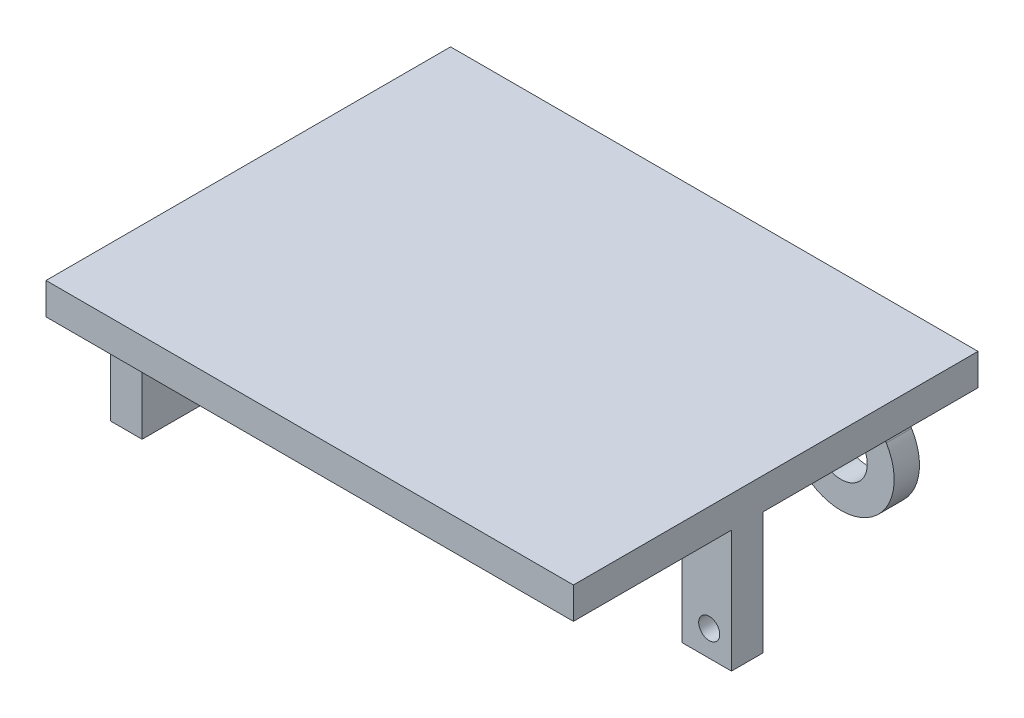
ISO-10303-21;
HEADER;
FILE_DESCRIPTION(('STEP AP214'),'2;1');
FILE_NAME('part.step','',(''),(''),'','','');
FILE_SCHEMA(('AUTOMOTIVE_DESIGN { 1 0 10303 214 1 1 1 1 }'));
ENDSEC;
DATA;
#1=APPLICATION_CONTEXT('core data for automotive mechanical design processes');
#2=APPLICATION_PROTOCOL_DEFINITION('international standard','automotive_design',2000,#1);
#3=PRODUCT_CONTEXT('',#1,'mechanical');
#4=PRODUCT('Part','Part','',(#3));
#5=PRODUCT_RELATED_PRODUCT_CATEGORY('part','',(#4));
#6=PRODUCT_DEFINITION_FORMATION('','',#4);
#7=PRODUCT_DEFINITION_CONTEXT('part definition',#1,'design');
#8=PRODUCT_DEFINITION('design','',#6,#7);
#9=PRODUCT_DEFINITION_SHAPE('','',#8);
#10=(LENGTH_UNIT() NAMED_UNIT(*) SI_UNIT(.MILLI.,.METRE.));
#11=(NAMED_UNIT(*) PLANE_ANGLE_UNIT() SI_UNIT($,.RADIAN.));
#12=(NAMED_UNIT(*) SI_UNIT($,.STERADIAN.) SOLID_ANGLE_UNIT());
#13=UNCERTAINTY_MEASURE_WITH_UNIT(LENGTH_MEASURE(1.E-05),#10,'distance_accuracy_value','');
#14=(GEOMETRIC_REPRESENTATION_CONTEXT(3) GLOBAL_UNCERTAINTY_ASSIGNED_CONTEXT((#13)) GLOBAL_UNIT_ASSIGNED_CONTEXT((#10,
#11,#12)) REPRESENTATION_CONTEXT('',''));
#15=CARTESIAN_POINT('',(0.,0.,0.));
#16=DIRECTION('',(0.,0.,1.));
#17=DIRECTION('',(1.,0.,0.));
#18=AXIS2_PLACEMENT_3D('',#15,#16,#17);
#19=CARTESIAN_POINT('',(0.375600944053645,9.13290377750628,2.4));
#20=DIRECTION('',(0.,1.,0.));
#21=DIRECTION('',(0.,0.,1.));
#22=AXIS2_PLACEMENT_3D('',#19,#20,#21);
#23=PLANE('',#22);
#24=DIRECTION('',(-1.,0.,0.));
#25=VECTOR('',#24,1.);
#26=CARTESIAN_POINT('',(-24.690248118354,9.13290377750628,20.4));
#27=LINE('',#26,#25);
#28=CARTESIAN_POINT('',(-17.6902481183561,9.13290377750628,20.4));
#29=VERTEX_POINT('',#28);
#30=CARTESIAN_POINT('',(-24.690248118354,9.13290377750628,20.4));
#31=VERTEX_POINT('',#30);
#32=EDGE_CURVE('E276',#29,#31,#27,.T.);
#33=ORIENTED_EDGE('',*,*,#32,.T.);
#34=DIRECTION('',(0.,0.,1.));
#35=VECTOR('',#34,1.);
#36=CARTESIAN_POINT('',(-24.690248118354,9.13290377750628,20.4));
#37=LINE('',#36,#35);
#38=CARTESIAN_POINT('',(-24.690248118354,9.13290377750628,23.4));
#39=VERTEX_POINT('',#38);
#40=EDGE_CURVE('E289',#31,#39,#37,.T.);
#41=ORIENTED_EDGE('',*,*,#40,.T.);
#42=DIRECTION('',(-1.,0.,0.));
#43=VECTOR('',#42,1.);
#44=CARTESIAN_POINT('',(-24.690248118354,9.13290377750628,23.4));
#45=LINE('',#44,#43);
#46=CARTESIAN_POINT('',(-17.6902481183561,9.13290377750628,23.4));
#47=VERTEX_POINT('',#46);
#48=EDGE_CURVE('E271',#47,#39,#45,.T.);
#49=ORIENTED_EDGE('',*,*,#48,.F.);
#50=DIRECTION('',(0.,0.,1.));
#51=VECTOR('',#50,1.);
#52=CARTESIAN_POINT('',(-17.6902481183561,9.13290377750628,20.4));
#53=LINE('',#52,#51);
#54=EDGE_CURVE('E293',#29,#47,#53,.T.);
#55=ORIENTED_EDGE('',*,*,#54,.F.);
#56=EDGE_LOOP('',(#33,#41,#49,#55));
#57=FACE_BOUND('',#56,.T.);
#58=DIRECTION('',(-1.,0.,0.));
#59=VECTOR('',#58,1.);
#60=CARTESIAN_POINT('',(-36.4472483248975,9.13290377750629,13.075983));
#61=LINE('',#60,#59);
#62=CARTESIAN_POINT('',(-36.4472483248975,9.13290377750628,13.075983));
#63=VERTEX_POINT('',#62);
#64=CARTESIAN_POINT('',(-39.4472483248975,9.13290377750628,13.075983));
#65=VERTEX_POINT('',#64);
#66=EDGE_CURVE('E50',#63,#65,#61,.T.);
#67=ORIENTED_EDGE('',*,*,#66,.F.);
#68=DIRECTION('',(0.,0.,1.));
#69=VECTOR('',#68,1.);
#70=CARTESIAN_POINT('',(-36.4472483248975,9.13290377750629,6.124016));
#71=LINE('',#70,#69);
#72=CARTESIAN_POINT('',(-36.4472483248975,9.13290377750628,6.12401599999998));
#73=VERTEX_POINT('',#72);
#74=EDGE_CURVE('E55',#73,#63,#71,.T.);
#75=ORIENTED_EDGE('',*,*,#74,.F.);
#76=DIRECTION('',(-1.,0.,0.));
#77=VECTOR('',#76,1.);
#78=CARTESIAN_POINT('',(-36.4472483248975,9.13290377750629,6.124016));
#79=LINE('',#78,#77);
#80=CARTESIAN_POINT('',(-39.4472483248975,9.13290377750629,6.124016));
#81=VERTEX_POINT('',#80);
#82=EDGE_CURVE('E216',#73,#81,#79,.T.);
#83=ORIENTED_EDGE('',*,*,#82,.T.);
#84=DIRECTION('',(0.,0.,-1.));
#85=VECTOR('',#84,1.);
#86=CARTESIAN_POINT('',(-39.4472483248975,9.13290377750628,2.4));
#87=LINE('',#86,#85);
#88=CARTESIAN_POINT('',(-39.4472483248975,9.13290377750628,0.));
#89=VERTEX_POINT('',#88);
#90=EDGE_CURVE('E392',#81,#89,#87,.T.);
#91=ORIENTED_EDGE('',*,*,#90,.T.);
#92=DIRECTION('',(1.,0.,0.));
#93=VECTOR('',#92,1.);
#94=CARTESIAN_POINT('',(-39.4472483248975,9.13290377750628,0.));
#95=LINE('',#94,#93);
#96=CARTESIAN_POINT('',(-13.4706940053491,9.13290377750628,0.));
#97=VERTEX_POINT('',#96);
#98=EDGE_CURVE('E367',#89,#97,#95,.T.);
#99=ORIENTED_EDGE('',*,*,#98,.T.);
#100=DIRECTION('',(0.,0.,-1.));
#101=VECTOR('',#100,1.);
#102=CARTESIAN_POINT('',(-13.4706940053491,9.13290377750628,2.4));
#103=LINE('',#102,#101);
#104=CARTESIAN_POINT('',(-13.4706940053491,9.13290377750628,2.4));
#105=VERTEX_POINT('',#104);
#106=EDGE_CURVE('E389',#105,#97,#103,.T.);
#107=ORIENTED_EDGE('',*,*,#106,.F.);
#108=DIRECTION('',(1.,0.,0.));
#109=VECTOR('',#108,1.);
#110=CARTESIAN_POINT('',(-39.4472483248975,9.13290377750628,2.4));
#111=LINE('',#110,#109);
#112=CARTESIAN_POINT('',(0.375600944053645,9.13290377750628,2.4));
#113=VERTEX_POINT('',#112);
#114=EDGE_CURVE('E11',#105,#113,#111,.T.);
#115=ORIENTED_EDGE('',*,*,#114,.T.);
#116=DIRECTION('',(0.,0.,-1.));
#117=VECTOR('',#116,1.);
#118=CARTESIAN_POINT('',(0.375600944053645,9.13290377750628,2.4));
#119=LINE('',#118,#117);
#120=CARTESIAN_POINT('',(0.375600944053645,9.13290377750628,0.));
#121=VERTEX_POINT('',#120);
#122=EDGE_CURVE('E380',#113,#121,#119,.T.);
#123=ORIENTED_EDGE('',*,*,#122,.T.);
#124=DIRECTION('',(1.,0.,0.));
#125=VECTOR('',#124,1.);
#126=CARTESIAN_POINT('',(0.375600944053645,9.13290377750628,0.));
#127=LINE('',#126,#125);
#128=CARTESIAN_POINT('',(10.6097508816418,9.13290377750628,0.));
#129=VERTEX_POINT('',#128);
#130=EDGE_CURVE('E355',#121,#129,#127,.T.);
#131=ORIENTED_EDGE('',*,*,#130,.T.);
#132=DIRECTION('',(0.,0.,-1.));
#133=VECTOR('',#132,1.);
#134=CARTESIAN_POINT('',(10.6097508816418,9.13290377750628,2.4));
#135=LINE('',#134,#133);
#136=CARTESIAN_POINT('',(10.6097508816418,9.13290377750628,20.4));
#137=VERTEX_POINT('',#136);
#138=EDGE_CURVE('E359',#137,#129,#135,.T.);
#139=ORIENTED_EDGE('',*,*,#138,.F.);
#140=DIRECTION('',(-1.,0.,0.));
#141=VECTOR('',#140,1.);
#142=CARTESIAN_POINT('',(5.90975088164212,9.13290377750628,20.4));
#143=LINE('',#142,#141);
#144=CARTESIAN_POINT('',(5.90975088164212,9.13290377750628,20.4));
#145=VERTEX_POINT('',#144);
#146=EDGE_CURVE('E314',#137,#145,#143,.T.);
#147=ORIENTED_EDGE('',*,*,#146,.T.);
#148=DIRECTION('',(0.,0.,1.));
#149=VECTOR('',#148,1.);
#150=CARTESIAN_POINT('',(5.90975088164212,9.13290377750628,20.4));
#151=LINE('',#150,#149);
#152=CARTESIAN_POINT('',(5.90975088164212,9.13290377750628,23.4));
#153=VERTEX_POINT('',#152);
#154=EDGE_CURVE('E327',#145,#153,#151,.T.);
#155=ORIENTED_EDGE('',*,*,#154,.T.);
#156=DIRECTION('',(-1.,0.,0.));
#157=VECTOR('',#156,1.);
#158=CARTESIAN_POINT('',(5.90975088164212,9.13290377750628,23.4));
#159=LINE('',#158,#157);
#160=CARTESIAN_POINT('',(10.6097508816418,9.13290377750628,23.4));
#161=VERTEX_POINT('',#160);
#162=EDGE_CURVE('E309',#161,#153,#159,.T.);
#163=ORIENTED_EDGE('',*,*,#162,.F.);
#164=CARTESIAN_POINT('',(10.6097508816418,9.13290377750628,38.4));
#165=VERTEX_POINT('',#164);
#166=EDGE_CURVE('E377',#165,#161,#135,.T.);
#167=ORIENTED_EDGE('',*,*,#166,.F.);
#168=DIRECTION('',(1.,0.,0.));
#169=VECTOR('',#168,1.);
#170=CARTESIAN_POINT('',(-39.4472483248975,9.13290377750628,38.4));
#171=LINE('',#170,#169);
#172=CARTESIAN_POINT('',(-39.4472483248975,9.13290377750628,38.4));
#173=VERTEX_POINT('',#172);
#174=EDGE_CURVE('E336',#173,#165,#171,.T.);
#175=ORIENTED_EDGE('',*,*,#174,.F.);
#176=CARTESIAN_POINT('',(-39.4472483248975,9.13290377750628,32.275984));
#177=VERTEX_POINT('',#176);
#178=EDGE_CURVE('E393',#173,#177,#87,.T.);
#179=ORIENTED_EDGE('',*,*,#178,.T.);
#180=DIRECTION('',(-1.,0.,0.));
#181=VECTOR('',#180,1.);
#182=CARTESIAN_POINT('',(-36.4472483248975,9.13290377750628,32.275984));
#183=LINE('',#182,#181);
#184=CARTESIAN_POINT('',(-36.4472483248975,9.13290377750628,32.275984));
#185=VERTEX_POINT('',#184);
#186=EDGE_CURVE('E251',#185,#177,#183,.T.);
#187=ORIENTED_EDGE('',*,*,#186,.F.);
#188=DIRECTION('',(0.,0.,1.));
#189=VECTOR('',#188,1.);
#190=CARTESIAN_POINT('',(-36.4472483248975,9.13290377750628,32.275984));
#191=LINE('',#190,#189);
#192=CARTESIAN_POINT('',(-36.4472483248975,9.13290377750628,25.324017));
#193=VERTEX_POINT('',#192);
#194=EDGE_CURVE('E237',#193,#185,#191,.T.);
#195=ORIENTED_EDGE('',*,*,#194,.F.);
#196=DIRECTION('',(-1.,0.,0.));
#197=VECTOR('',#196,1.);
#198=CARTESIAN_POINT('',(-36.4472483248975,9.13290377750628,25.324017));
#199=LINE('',#198,#197);
#200=CARTESIAN_POINT('',(-39.4472483248975,9.13290377750628,25.324017));
#201=VERTEX_POINT('',#200);
#202=EDGE_CURVE('E254',#193,#201,#199,.T.);
#203=ORIENTED_EDGE('',*,*,#202,.T.);
#204=EDGE_CURVE('E395',#201,#65,#87,.T.);
#205=ORIENTED_EDGE('',*,*,#204,.T.);
#206=EDGE_LOOP('',(#67,#75,#83,#91,#99,#107,#115,#123,#131,#139,#147,#155,#163,#167,#175,#179,
#187,#195,#203,#205));
#207=FACE_BOUND('',#206,.T.);
#208=ADVANCED_FACE('F34',(#57,#207),#23,.F.);
#209=CARTESIAN_POINT('',(-1.02695629777827E-12,-8.59013381260265E-13,2.4));
#210=DIRECTION('',(0.,0.,1.));
#211=DIRECTION('',(1.,0.,0.));
#212=AXIS2_PLACEMENT_3D('',#209,#210,#211);
#213=PLANE('',#212);
#214=ORIENTED_EDGE('',*,*,#114,.F.);
#215=DIRECTION('',(0.616631037907866,-0.787252286810694,0.));
#216=VECTOR('',#215,1.);
#217=CARTESIAN_POINT('',(-13.4706940053491,9.13290377750628,2.4));
#218=LINE('',#217,#216);
#219=CARTESIAN_POINT('',(-3.35801161441651,-3.77794865876277,2.4));
#220=VERTEX_POINT('',#219);
#221=EDGE_CURVE('E352',#105,#220,#218,.T.);
#222=ORIENTED_EDGE('',*,*,#221,.T.);
#223=CARTESIAN_POINT('',(-1.02695629777827E-12,-8.59013381260265E-13,2.4));
#224=DIRECTION('',(0.,0.,1.));
#225=DIRECTION('',(1.,0.,0.));
#226=AXIS2_PLACEMENT_3D('',#223,#224,#225);
#227=CIRCLE('',#226,5.0546155215595);
#228=CARTESIAN_POINT('',(4.30431290479305,2.64991103405545,2.4));
#229=VERTEX_POINT('',#228);
#230=EDGE_CURVE('E354',#220,#229,#227,.T.);
#231=ORIENTED_EDGE('',*,*,#230,.T.);
#232=DIRECTION('',(-0.518265579164981,0.855219731678816,0.));
#233=VECTOR('',#232,1.);
#234=CARTESIAN_POINT('',(4.30431290479305,2.64991103405545,2.4));
#235=LINE('',#234,#233);
#236=EDGE_CURVE('E357',#229,#113,#235,.T.);
#237=ORIENTED_EDGE('',*,*,#236,.T.);
#238=EDGE_LOOP('',(#214,#222,#231,#237));
#239=FACE_BOUND('',#238,.T.);
#240=CARTESIAN_POINT('',(-1.02695629777827E-12,-8.59013381260265E-13,2.4));
#241=DIRECTION('',(0.,0.,1.));
#242=DIRECTION('',(1.,0.,0.));
#243=AXIS2_PLACEMENT_3D('',#240,#241,#242);
#244=CIRCLE('',#243,2.49999999999947);
#245=CARTESIAN_POINT('',(2.49999999999844,-8.59013381260265E-13,2.4));
#246=VERTEX_POINT('',#245);
#247=EDGE_CURVE('E346',#246,#246,#244,.T.);
#248=ORIENTED_EDGE('',*,*,#247,.F.);
#249=EDGE_LOOP('',(#248));
#250=FACE_BOUND('',#249,.T.);
#251=ADVANCED_FACE('F429',(#239,#250),#213,.T.);
#252=CARTESIAN_POINT('',(-1.02695629777827E-12,-8.59013381260265E-13,0.));
#253=DIRECTION('',(0.,0.,1.));
#254=DIRECTION('',(1.,0.,0.));
#255=AXIS2_PLACEMENT_3D('',#252,#253,#254);
#256=PLANE('',#255);
#257=DIRECTION('',(0.,1.,0.));
#258=VECTOR('',#257,1.);
#259=CARTESIAN_POINT('',(10.6097508816418,9.13290377750628,0.));
#260=LINE('',#259,#258);
#261=CARTESIAN_POINT('',(10.6097508816418,12.1289037733501,0.));
#262=VERTEX_POINT('',#261);
#263=EDGE_CURVE('E349',#129,#262,#260,.T.);
#264=ORIENTED_EDGE('',*,*,#263,.F.);
#265=ORIENTED_EDGE('',*,*,#130,.F.);
#266=DIRECTION('',(-0.518265579164981,0.855219731678816,0.));
#267=VECTOR('',#266,1.);
#268=CARTESIAN_POINT('',(4.30431290479305,2.64991103405545,0.));
#269=LINE('',#268,#267);
#270=CARTESIAN_POINT('',(4.30431290479305,2.64991103405545,0.));
#271=VERTEX_POINT('',#270);
#272=EDGE_CURVE('E373',#271,#121,#269,.T.);
#273=ORIENTED_EDGE('',*,*,#272,.F.);
#274=CARTESIAN_POINT('',(-1.02695629777827E-12,-8.59013381260265E-13,0.));
#275=DIRECTION('',(0.,0.,1.));
#276=DIRECTION('',(1.,0.,0.));
#277=AXIS2_PLACEMENT_3D('',#274,#275,#276);
#278=CIRCLE('',#277,5.0546155215595);
#279=CARTESIAN_POINT('',(-3.35801161441651,-3.77794865876277,0.));
#280=VERTEX_POINT('',#279);
#281=EDGE_CURVE('E371',#280,#271,#278,.T.);
#282=ORIENTED_EDGE('',*,*,#281,.F.);
#283=DIRECTION('',(0.616631037907866,-0.787252286810694,0.));
#284=VECTOR('',#283,1.);
#285=CARTESIAN_POINT('',(-13.4706940053491,9.13290377750628,0.));
#286=LINE('',#285,#284);
#287=EDGE_CURVE('E369',#97,#280,#286,.T.);
#288=ORIENTED_EDGE('',*,*,#287,.F.);
#289=ORIENTED_EDGE('',*,*,#98,.F.);
#290=DIRECTION('',(0.,-1.,0.));
#291=VECTOR('',#290,1.);
#292=CARTESIAN_POINT('',(-39.4472483248975,12.1289037733501,0.));
#293=LINE('',#292,#291);
#294=CARTESIAN_POINT('',(-39.4472483248975,12.1289037733501,0.));
#295=VERTEX_POINT('',#294);
#296=EDGE_CURVE('E364',#295,#89,#293,.T.);
#297=ORIENTED_EDGE('',*,*,#296,.F.);
#298=DIRECTION('',(-1.,0.,0.));
#299=VECTOR('',#298,1.);
#300=CARTESIAN_POINT('',(-39.4472483248975,12.1289037733501,0.));
#301=LINE('',#300,#299);
#302=EDGE_CURVE('E362',#262,#295,#301,.T.);
#303=ORIENTED_EDGE('',*,*,#302,.F.);
#304=EDGE_LOOP('',(#264,#265,#273,#282,#288,#289,#297,#303));
#305=FACE_BOUND('',#304,.T.);
#306=CARTESIAN_POINT('',(-1.02695629777827E-12,-8.59013381260265E-13,0.));
#307=DIRECTION('',(0.,0.,1.));
#308=DIRECTION('',(1.,0.,0.));
#309=AXIS2_PLACEMENT_3D('',#306,#307,#308);
#310=CIRCLE('',#309,2.49999999999947);
#311=CARTESIAN_POINT('',(2.49999999999844,-8.59013381260265E-13,0.));
#312=VERTEX_POINT('',#311);
#313=EDGE_CURVE('E344',#312,#312,#310,.T.);
#314=ORIENTED_EDGE('',*,*,#313,.T.);
#315=EDGE_LOOP('',(#314));
#316=FACE_BOUND('',#315,.T.);
#317=ADVANCED_FACE('F410',(#305,#316),#256,.F.);
#318=CARTESIAN_POINT('',(10.6097508816418,9.13290377750628,2.4));
#319=DIRECTION('',(-1.,0.,0.));
#320=DIRECTION('',(0.,0.,1.));
#321=AXIS2_PLACEMENT_3D('',#318,#319,#320);
#322=PLANE('',#321);
#323=ORIENTED_EDGE('',*,*,#263,.T.);
#324=DIRECTION('',(0.,0.,-1.));
#325=VECTOR('',#324,1.);
#326=CARTESIAN_POINT('',(10.6097508816418,12.1289037733501,2.4));
#327=LINE('',#326,#325);
#328=CARTESIAN_POINT('',(10.6097508816418,12.1289037733501,38.4));
#329=VERTEX_POINT('',#328);
#330=EDGE_CURVE('E38',#329,#262,#327,.T.);
#331=ORIENTED_EDGE('',*,*,#330,.F.);
#332=DIRECTION('',(0.,1.,0.));
#333=VECTOR('',#332,1.);
#334=CARTESIAN_POINT('',(10.6097508816418,9.13290377750628,38.4));
#335=LINE('',#334,#333);
#336=EDGE_CURVE('E339',#165,#329,#335,.T.);
#337=ORIENTED_EDGE('',*,*,#336,.F.);
#338=ORIENTED_EDGE('',*,*,#166,.T.);
#339=DIRECTION('',(0.,1.,0.));
#340=VECTOR('',#339,1.);
#341=CARTESIAN_POINT('',(10.6097508816418,9.13290377750628,23.4));
#342=LINE('',#341,#340);
#343=CARTESIAN_POINT('',(10.6097508816418,-2.45709622249371,23.4));
#344=VERTEX_POINT('',#343);
#345=EDGE_CURVE('E323',#344,#161,#342,.T.);
#346=ORIENTED_EDGE('',*,*,#345,.F.);
#347=DIRECTION('',(0.,0.,1.));
#348=VECTOR('',#347,1.);
#349=CARTESIAN_POINT('',(10.6097508816418,-2.45709622249371,20.4));
#350=LINE('',#349,#348);
#351=CARTESIAN_POINT('',(10.6097508816418,-2.45709622249371,20.4));
#352=VERTEX_POINT('',#351);
#353=EDGE_CURVE('E331',#352,#344,#350,.T.);
#354=ORIENTED_EDGE('',*,*,#353,.F.);
#355=DIRECTION('',(0.,1.,0.));
#356=VECTOR('',#355,1.);
#357=CARTESIAN_POINT('',(10.6097508816418,9.13290377750628,20.4));
#358=LINE('',#357,#356);
#359=EDGE_CURVE('E312',#352,#137,#358,.T.);
#360=ORIENTED_EDGE('',*,*,#359,.T.);
#361=ORIENTED_EDGE('',*,*,#138,.T.);
#362=EDGE_LOOP('',(#323,#331,#337,#338,#346,#354,#360,#361));
#363=FACE_BOUND('',#362,.T.);
#364=ADVANCED_FACE('F36',(#363),#322,.F.);
#365=CARTESIAN_POINT('',(-39.4472483248975,12.1289037733501,2.4));
#366=DIRECTION('',(0.,-1.,0.));
#367=DIRECTION('',(0.,0.,-1.));
#368=AXIS2_PLACEMENT_3D('',#365,#366,#367);
#369=PLANE('',#368);
#370=ORIENTED_EDGE('',*,*,#302,.T.);
#371=DIRECTION('',(0.,0.,-1.));
#372=VECTOR('',#371,1.);
#373=CARTESIAN_POINT('',(-39.4472483248975,12.1289037733501,2.4));
#374=LINE('',#373,#372);
#375=CARTESIAN_POINT('',(-39.4472483248975,12.1289037733501,38.4));
#376=VERTEX_POINT('',#375);
#377=EDGE_CURVE('E394',#376,#295,#374,.T.);
#378=ORIENTED_EDGE('',*,*,#377,.F.);
#379=DIRECTION('',(-1.,0.,0.));
#380=VECTOR('',#379,1.);
#381=CARTESIAN_POINT('',(10.6097508816418,12.1289037733501,38.4));
#382=LINE('',#381,#380);
#383=EDGE_CURVE('E342',#329,#376,#382,.T.);
#384=ORIENTED_EDGE('',*,*,#383,.F.);
#385=ORIENTED_EDGE('',*,*,#330,.T.);
#386=EDGE_LOOP('',(#370,#378,#384,#385));
#387=FACE_BOUND('',#386,.T.);
#388=ADVANCED_FACE('F403',(#387),#369,.F.);
#389=CARTESIAN_POINT('',(-39.4472483248975,12.1289037733501,2.4));
#390=DIRECTION('',(1.,0.,0.));
#391=DIRECTION('',(0.,0.,-1.));
#392=AXIS2_PLACEMENT_3D('',#389,#390,#391);
#393=PLANE('',#392);
#394=ORIENTED_EDGE('',*,*,#296,.T.);
#395=ORIENTED_EDGE('',*,*,#90,.F.);
#396=DIRECTION('',(0.,1.,0.));
#397=VECTOR('',#396,1.);
#398=CARTESIAN_POINT('',(-39.4472483248975,-2.49109835249372,6.12401599999998));
#399=LINE('',#398,#397);
#400=CARTESIAN_POINT('',(-39.4472483248975,-2.49109835249372,6.12401599999998));
#401=VERTEX_POINT('',#400);
#402=EDGE_CURVE('E223',#401,#81,#399,.T.);
#403=ORIENTED_EDGE('',*,*,#402,.F.);
#404=DIRECTION('',(0.,0.,-1.));
#405=VECTOR('',#404,1.);
#406=CARTESIAN_POINT('',(-39.4472483248975,-2.49109835249372,13.075983));
#407=LINE('',#406,#405);
#408=CARTESIAN_POINT('',(-39.4472483248975,-2.49109835249372,13.075983));
#409=VERTEX_POINT('',#408);
#410=EDGE_CURVE('E221',#409,#401,#407,.T.);
#411=ORIENTED_EDGE('',*,*,#410,.F.);
#412=DIRECTION('',(0.,-1.,0.));
#413=VECTOR('',#412,1.);
#414=CARTESIAN_POINT('',(-39.4472483248975,-2.49109835249372,13.075983));
#415=LINE('',#414,#413);
#416=EDGE_CURVE('E206',#65,#409,#415,.T.);
#417=ORIENTED_EDGE('',*,*,#416,.F.);
#418=ORIENTED_EDGE('',*,*,#204,.F.);
#419=DIRECTION('',(0.,1.,0.));
#420=VECTOR('',#419,1.);
#421=CARTESIAN_POINT('',(-39.4472483248975,-2.49109835249372,25.324017));
#422=LINE('',#421,#420);
#423=CARTESIAN_POINT('',(-39.4472483248975,-2.49109835249372,25.324017));
#424=VERTEX_POINT('',#423);
#425=EDGE_CURVE('E245',#424,#201,#422,.T.);
#426=ORIENTED_EDGE('',*,*,#425,.F.);
#427=DIRECTION('',(0.,0.,-1.));
#428=VECTOR('',#427,1.);
#429=CARTESIAN_POINT('',(-39.4472483248975,-2.49109835249372,32.275984));
#430=LINE('',#429,#428);
#431=CARTESIAN_POINT('',(-39.4472483248975,-2.49109835249372,32.275984));
#432=VERTEX_POINT('',#431);
#433=EDGE_CURVE('E229',#432,#424,#430,.T.);
#434=ORIENTED_EDGE('',*,*,#433,.F.);
#435=DIRECTION('',(0.,-1.,0.));
#436=VECTOR('',#435,1.);
#437=CARTESIAN_POINT('',(-39.4472483248975,-2.49109835249372,32.275984));
#438=LINE('',#437,#436);
#439=EDGE_CURVE('E234',#177,#432,#438,.T.);
#440=ORIENTED_EDGE('',*,*,#439,.F.);
#441=ORIENTED_EDGE('',*,*,#178,.F.);
#442=DIRECTION('',(0.,-1.,0.));
#443=VECTOR('',#442,1.);
#444=CARTESIAN_POINT('',(-39.4472483248975,12.1289037733501,38.4));
#445=LINE('',#444,#443);
#446=EDGE_CURVE('E330',#376,#173,#445,.T.);
#447=ORIENTED_EDGE('',*,*,#446,.F.);
#448=ORIENTED_EDGE('',*,*,#377,.T.);
#449=EDGE_LOOP('',(#394,#395,#403,#411,#417,#418,#426,#434,#440,#441,#447,#448));
#450=FACE_BOUND('',#449,.T.);
#451=ADVANCED_FACE('F415',(#450),#393,.F.);
#452=CARTESIAN_POINT('',(-13.4706940053491,9.13290377750628,2.4));
#453=DIRECTION('',(0.787252286810694,0.616631037907866,0.));
#454=DIRECTION('',(-0.616631037907866,0.787252286810694,0.));
#455=AXIS2_PLACEMENT_3D('',#452,#453,#454);
#456=PLANE('',#455);
#457=ORIENTED_EDGE('',*,*,#287,.T.);
#458=DIRECTION('',(0.,0.,-1.));
#459=VECTOR('',#458,1.);
#460=CARTESIAN_POINT('',(-3.35801161441651,-3.77794865876277,2.4));
#461=LINE('',#460,#459);
#462=EDGE_CURVE('E386',#220,#280,#461,.T.);
#463=ORIENTED_EDGE('',*,*,#462,.F.);
#464=ORIENTED_EDGE('',*,*,#221,.F.);
#465=ORIENTED_EDGE('',*,*,#106,.T.);
#466=EDGE_LOOP('',(#457,#463,#464,#465));
#467=FACE_BOUND('',#466,.T.);
#468=ADVANCED_FACE('F447',(#467),#456,.F.);
#469=CARTESIAN_POINT('',(-1.02695629777827E-12,-8.59013381260265E-13,2.4));
#470=DIRECTION('',(0.,0.,-1.));
#471=DIRECTION('',(-1.,0.,0.));
#472=AXIS2_PLACEMENT_3D('',#469,#470,#471);
#473=CYLINDRICAL_SURFACE('',#472,5.0546155215595);
#474=ORIENTED_EDGE('',*,*,#281,.T.);
#475=DIRECTION('',(0.,0.,-1.));
#476=VECTOR('',#475,1.);
#477=CARTESIAN_POINT('',(4.30431290479305,2.64991103405545,2.4));
#478=LINE('',#477,#476);
#479=EDGE_CURVE('E383',#229,#271,#478,.T.);
#480=ORIENTED_EDGE('',*,*,#479,.F.);
#481=ORIENTED_EDGE('',*,*,#230,.F.);
#482=ORIENTED_EDGE('',*,*,#462,.T.);
#483=EDGE_LOOP('',(#474,#480,#481,#482));
#484=FACE_BOUND('',#483,.T.);
#485=ADVANCED_FACE('F443',(#484),#473,.T.);
#486=CARTESIAN_POINT('',(4.30431290479305,2.64991103405545,2.4));
#487=DIRECTION('',(-0.855219731678816,-0.518265579164981,0.));
#488=DIRECTION('',(0.518265579164981,-0.855219731678817,0.));
#489=AXIS2_PLACEMENT_3D('',#486,#487,#488);
#490=PLANE('',#489);
#491=ORIENTED_EDGE('',*,*,#272,.T.);
#492=ORIENTED_EDGE('',*,*,#122,.F.);
#493=ORIENTED_EDGE('',*,*,#236,.F.);
#494=ORIENTED_EDGE('',*,*,#479,.T.);
#495=EDGE_LOOP('',(#491,#492,#493,#494));
#496=FACE_BOUND('',#495,.T.);
#497=ADVANCED_FACE('F439',(#496),#490,.F.);
#498=CARTESIAN_POINT('',(-1.02695629777827E-12,-8.59013381260265E-13,2.4));
#499=DIRECTION('',(0.,0.,-1.));
#500=DIRECTION('',(-1.,0.,0.));
#501=AXIS2_PLACEMENT_3D('',#498,#499,#500);
#502=CYLINDRICAL_SURFACE('',#501,2.49999999999947);
#503=ORIENTED_EDGE('',*,*,#247,.T.);
#504=EDGE_LOOP('',(#503));
#505=FACE_BOUND('',#504,.T.);
#506=ORIENTED_EDGE('',*,*,#313,.F.);
#507=EDGE_LOOP('',(#506));
#508=FACE_BOUND('',#507,.T.);
#509=ADVANCED_FACE('F442',(#505,#508),#502,.F.);
#510=CARTESIAN_POINT('',(0.,0.,38.4));
#511=DIRECTION('',(0.,0.,1.));
#512=DIRECTION('',(1.,0.,0.));
#513=AXIS2_PLACEMENT_3D('',#510,#511,#512);
#514=PLANE('',#513);
#515=ORIENTED_EDGE('',*,*,#446,.T.);
#516=ORIENTED_EDGE('',*,*,#174,.T.);
#517=ORIENTED_EDGE('',*,*,#336,.T.);
#518=ORIENTED_EDGE('',*,*,#383,.T.);
#519=EDGE_LOOP('',(#515,#516,#517,#518));
#520=FACE_BOUND('',#519,.T.);
#521=ADVANCED_FACE('F497',(#520),#514,.T.);
#522=CARTESIAN_POINT('',(5.90975088164212,9.13290377750628,20.4));
#523=DIRECTION('',(-1.,0.,0.));
#524=DIRECTION('',(0.,-1.,0.));
#525=AXIS2_PLACEMENT_3D('',#522,#523,#524);
#526=PLANE('',#525);
#527=DIRECTION('',(0.,-1.,0.));
#528=VECTOR('',#527,1.);
#529=CARTESIAN_POINT('',(5.90975088164212,9.13290377750628,23.4));
#530=LINE('',#529,#528);
#531=CARTESIAN_POINT('',(5.90975088164213,-2.45709622249371,23.4));
#532=VERTEX_POINT('',#531);
#533=EDGE_CURVE('E302',#153,#532,#530,.T.);
#534=ORIENTED_EDGE('',*,*,#533,.F.);
#535=ORIENTED_EDGE('',*,*,#154,.F.);
#536=DIRECTION('',(0.,-1.,0.));
#537=VECTOR('',#536,1.);
#538=CARTESIAN_POINT('',(5.90975088164212,9.13290377750628,20.4));
#539=LINE('',#538,#537);
#540=CARTESIAN_POINT('',(5.90975088164213,-2.45709622249371,20.4));
#541=VERTEX_POINT('',#540);
#542=EDGE_CURVE('E305',#145,#541,#539,.T.);
#543=ORIENTED_EDGE('',*,*,#542,.T.);
#544=DIRECTION('',(0.,0.,1.));
#545=VECTOR('',#544,1.);
#546=CARTESIAN_POINT('',(5.90975088164213,-2.45709622249371,20.4));
#547=LINE('',#546,#545);
#548=EDGE_CURVE('E317',#541,#532,#547,.T.);
#549=ORIENTED_EDGE('',*,*,#548,.T.);
#550=EDGE_LOOP('',(#534,#535,#543,#549));
#551=FACE_BOUND('',#550,.T.);
#552=ADVANCED_FACE('F501',(#551),#526,.T.);
#553=CARTESIAN_POINT('',(5.90975088164213,-2.45709622249371,20.4));
#554=DIRECTION('',(0.,-1.,0.));
#555=DIRECTION('',(1.,0.,0.));
#556=AXIS2_PLACEMENT_3D('',#553,#554,#555);
#557=PLANE('',#556);
#558=DIRECTION('',(1.,0.,0.));
#559=VECTOR('',#558,1.);
#560=CARTESIAN_POINT('',(5.90975088164213,-2.45709622249371,23.4));
#561=LINE('',#560,#559);
#562=EDGE_CURVE('E320',#532,#344,#561,.T.);
#563=ORIENTED_EDGE('',*,*,#562,.F.);
#564=ORIENTED_EDGE('',*,*,#548,.F.);
#565=DIRECTION('',(1.,0.,0.));
#566=VECTOR('',#565,1.);
#567=CARTESIAN_POINT('',(5.90975088164213,-2.45709622249371,20.4));
#568=LINE('',#567,#566);
#569=EDGE_CURVE('E308',#541,#352,#568,.T.);
#570=ORIENTED_EDGE('',*,*,#569,.T.);
#571=ORIENTED_EDGE('',*,*,#353,.T.);
#572=EDGE_LOOP('',(#563,#564,#570,#571));
#573=FACE_BOUND('',#572,.T.);
#574=ADVANCED_FACE('F516',(#573),#557,.T.);
#575=CARTESIAN_POINT('',(0.,0.,20.4));
#576=DIRECTION('',(0.,0.,1.));
#577=DIRECTION('',(1.,0.,0.));
#578=AXIS2_PLACEMENT_3D('',#575,#576,#577);
#579=PLANE('',#578);
#580=CARTESIAN_POINT('',(8.49999999987004,-9.15933995315754E-13,20.4));
#581=DIRECTION('',(0.,0.,1.));
#582=DIRECTION('',(1.,0.,0.));
#583=AXIS2_PLACEMENT_3D('',#580,#581,#582);
#584=CIRCLE('',#583,1.00000000000377);
#585=CARTESIAN_POINT('',(9.49999999987382,-9.15933995315754E-13,20.4));
#586=VERTEX_POINT('',#585);
#587=EDGE_CURVE('E299',#586,#586,#584,.T.);
#588=ORIENTED_EDGE('',*,*,#587,.T.);
#589=EDGE_LOOP('',(#588));
#590=FACE_BOUND('',#589,.T.);
#591=ORIENTED_EDGE('',*,*,#542,.F.);
#592=ORIENTED_EDGE('',*,*,#146,.F.);
#593=ORIENTED_EDGE('',*,*,#359,.F.);
#594=ORIENTED_EDGE('',*,*,#569,.F.);
#595=EDGE_LOOP('',(#591,#592,#593,#594));
#596=FACE_BOUND('',#595,.T.);
#597=ADVANCED_FACE('F526',(#590,#596),#579,.F.);
#598=CARTESIAN_POINT('',(0.,0.,23.4));
#599=DIRECTION('',(0.,0.,1.));
#600=DIRECTION('',(1.,0.,0.));
#601=AXIS2_PLACEMENT_3D('',#598,#599,#600);
#602=PLANE('',#601);
#603=CARTESIAN_POINT('',(8.49999999987004,-9.15933995315754E-13,23.4));
#604=DIRECTION('',(0.,0.,1.));
#605=DIRECTION('',(1.,0.,0.));
#606=AXIS2_PLACEMENT_3D('',#603,#604,#605);
#607=CIRCLE('',#606,1.00000000000377);
#608=CARTESIAN_POINT('',(9.49999999987382,-9.15933995315754E-13,23.4));
#609=VERTEX_POINT('',#608);
#610=EDGE_CURVE('E292',#609,#609,#607,.T.);
#611=ORIENTED_EDGE('',*,*,#610,.F.);
#612=EDGE_LOOP('',(#611));
#613=FACE_BOUND('',#612,.T.);
#614=ORIENTED_EDGE('',*,*,#533,.T.);
#615=ORIENTED_EDGE('',*,*,#562,.T.);
#616=ORIENTED_EDGE('',*,*,#345,.T.);
#617=ORIENTED_EDGE('',*,*,#162,.T.);
#618=EDGE_LOOP('',(#614,#615,#616,#617));
#619=FACE_BOUND('',#618,.T.);
#620=ADVANCED_FACE('F536',(#613,#619),#602,.T.);
#621=CARTESIAN_POINT('',(8.49999999987004,-9.15933995315754E-13,20.4));
#622=DIRECTION('',(0.,0.,1.));
#623=DIRECTION('',(1.,0.,0.));
#624=AXIS2_PLACEMENT_3D('',#621,#622,#623);
#625=CYLINDRICAL_SURFACE('',#624,1.00000000000377);
#626=ORIENTED_EDGE('',*,*,#587,.F.);
#627=EDGE_LOOP('',(#626));
#628=FACE_BOUND('',#627,.T.);
#629=ORIENTED_EDGE('',*,*,#610,.T.);
#630=EDGE_LOOP('',(#629));
#631=FACE_BOUND('',#630,.T.);
#632=ADVANCED_FACE('F546',(#628,#631),#625,.F.);
#633=CARTESIAN_POINT('',(-24.690248118354,9.13290377750628,20.4));
#634=DIRECTION('',(-1.,0.,0.));
#635=DIRECTION('',(0.,0.,1.));
#636=AXIS2_PLACEMENT_3D('',#633,#634,#635);
#637=PLANE('',#636);
#638=DIRECTION('',(0.,-1.,0.));
#639=VECTOR('',#638,1.);
#640=CARTESIAN_POINT('',(-24.690248118354,9.13290377750628,23.4));
#641=LINE('',#640,#639);
#642=CARTESIAN_POINT('',(-24.690248118354,-2.4601006024936,23.4));
#643=VERTEX_POINT('',#642);
#644=EDGE_CURVE('E264',#39,#643,#641,.T.);
#645=ORIENTED_EDGE('',*,*,#644,.F.);
#646=ORIENTED_EDGE('',*,*,#40,.F.);
#647=DIRECTION('',(0.,-1.,0.));
#648=VECTOR('',#647,1.);
#649=CARTESIAN_POINT('',(-24.690248118354,9.13290377750628,20.4));
#650=LINE('',#649,#648);
#651=CARTESIAN_POINT('',(-24.690248118354,-2.4601006024936,20.4));
#652=VERTEX_POINT('',#651);
#653=EDGE_CURVE('E267',#31,#652,#650,.T.);
#654=ORIENTED_EDGE('',*,*,#653,.T.);
#655=DIRECTION('',(0.,0.,1.));
#656=VECTOR('',#655,1.);
#657=CARTESIAN_POINT('',(-24.690248118354,-2.4601006024936,20.4));
#658=LINE('',#657,#656);
#659=EDGE_CURVE('E279',#652,#643,#658,.T.);
#660=ORIENTED_EDGE('',*,*,#659,.T.);
#661=EDGE_LOOP('',(#645,#646,#654,#660));
#662=FACE_BOUND('',#661,.T.);
#663=ADVANCED_FACE('F556',(#662),#637,.T.);
#664=CARTESIAN_POINT('',(-17.6902481183561,9.13290377750628,20.4));
#665=DIRECTION('',(1.,0.,0.));
#666=DIRECTION('',(0.,0.,-1.));
#667=AXIS2_PLACEMENT_3D('',#664,#665,#666);
#668=PLANE('',#667);
#669=DIRECTION('',(0.,1.,0.));
#670=VECTOR('',#669,1.);
#671=CARTESIAN_POINT('',(-17.6902481183561,9.13290377750628,23.4));
#672=LINE('',#671,#670);
#673=CARTESIAN_POINT('',(-17.6902481183561,-2.4601006024936,23.4));
#674=VERTEX_POINT('',#673);
#675=EDGE_CURVE('E285',#674,#47,#672,.T.);
#676=ORIENTED_EDGE('',*,*,#675,.F.);
#677=DIRECTION('',(0.,0.,1.));
#678=VECTOR('',#677,1.);
#679=CARTESIAN_POINT('',(-17.6902481183561,-2.4601006024936,20.4));
#680=LINE('',#679,#678);
#681=CARTESIAN_POINT('',(-17.6902481183561,-2.4601006024936,20.4));
#682=VERTEX_POINT('',#681);
#683=EDGE_CURVE('E296',#682,#674,#680,.T.);
#684=ORIENTED_EDGE('',*,*,#683,.F.);
#685=DIRECTION('',(0.,1.,0.));
#686=VECTOR('',#685,1.);
#687=CARTESIAN_POINT('',(-17.6902481183561,9.13290377750628,20.4));
#688=LINE('',#687,#686);
#689=EDGE_CURVE('E274',#682,#29,#688,.T.);
#690=ORIENTED_EDGE('',*,*,#689,.T.);
#691=ORIENTED_EDGE('',*,*,#54,.T.);
#692=EDGE_LOOP('',(#676,#684,#690,#691));
#693=FACE_BOUND('',#692,.T.);
#694=ADVANCED_FACE('F566',(#693),#668,.T.);
#695=CARTESIAN_POINT('',(-24.690248118354,-2.4601006024936,20.4));
#696=DIRECTION('',(0.,-1.,0.));
#697=DIRECTION('',(0.,0.,-1.));
#698=AXIS2_PLACEMENT_3D('',#695,#696,#697);
#699=PLANE('',#698);
#700=DIRECTION('',(1.,0.,0.));
#701=VECTOR('',#700,1.);
#702=CARTESIAN_POINT('',(-24.690248118354,-2.4601006024936,23.4));
#703=LINE('',#702,#701);
#704=EDGE_CURVE('E282',#643,#674,#703,.T.);
#705=ORIENTED_EDGE('',*,*,#704,.F.);
#706=ORIENTED_EDGE('',*,*,#659,.F.);
#707=DIRECTION('',(1.,0.,0.));
#708=VECTOR('',#707,1.);
#709=CARTESIAN_POINT('',(-24.690248118354,-2.4601006024936,20.4));
#710=LINE('',#709,#708);
#711=EDGE_CURVE('E270',#652,#682,#710,.T.);
#712=ORIENTED_EDGE('',*,*,#711,.T.);
#713=ORIENTED_EDGE('',*,*,#683,.T.);
#714=EDGE_LOOP('',(#705,#706,#712,#713));
#715=FACE_BOUND('',#714,.T.);
#716=ADVANCED_FACE('F576',(#715),#699,.T.);
#717=CARTESIAN_POINT('',(0.,0.,20.4));
#718=DIRECTION('',(0.,0.,1.));
#719=DIRECTION('',(1.,0.,0.));
#720=AXIS2_PLACEMENT_3D('',#717,#718,#719);
#721=PLANE('',#720);
#722=CARTESIAN_POINT('',(-19.5000000001287,-9.15933995315754E-13,20.4));
#723=DIRECTION('',(0.,0.,1.));
#724=DIRECTION('',(1.,0.,0.));
#725=AXIS2_PLACEMENT_3D('',#722,#723,#724);
#726=CIRCLE('',#725,0.999999999996459);
#727=CARTESIAN_POINT('',(-18.5000000001322,-9.15933995315754E-13,20.4));
#728=VERTEX_POINT('',#727);
#729=EDGE_CURVE('E261',#728,#728,#726,.T.);
#730=ORIENTED_EDGE('',*,*,#729,.T.);
#731=EDGE_LOOP('',(#730));
#732=FACE_BOUND('',#731,.T.);
#733=ORIENTED_EDGE('',*,*,#653,.F.);
#734=ORIENTED_EDGE('',*,*,#32,.F.);
#735=ORIENTED_EDGE('',*,*,#689,.F.);
#736=ORIENTED_EDGE('',*,*,#711,.F.);
#737=EDGE_LOOP('',(#733,#734,#735,#736));
#738=FACE_BOUND('',#737,.T.);
#739=ADVANCED_FACE('F586',(#732,#738),#721,.F.);
#740=CARTESIAN_POINT('',(0.,0.,23.4));
#741=DIRECTION('',(0.,0.,1.));
#742=DIRECTION('',(1.,0.,0.));
#743=AXIS2_PLACEMENT_3D('',#740,#741,#742);
#744=PLANE('',#743);
#745=CARTESIAN_POINT('',(-19.5000000001287,-9.15933995315754E-13,23.4));
#746=DIRECTION('',(0.,0.,1.));
#747=DIRECTION('',(1.,0.,0.));
#748=AXIS2_PLACEMENT_3D('',#745,#746,#747);
#749=CIRCLE('',#748,0.999999999996459);
#750=CARTESIAN_POINT('',(-18.5000000001322,-9.15933995315754E-13,23.4));
#751=VERTEX_POINT('',#750);
#752=EDGE_CURVE('E260',#751,#751,#749,.T.);
#753=ORIENTED_EDGE('',*,*,#752,.F.);
#754=EDGE_LOOP('',(#753));
#755=FACE_BOUND('',#754,.T.);
#756=ORIENTED_EDGE('',*,*,#644,.T.);
#757=ORIENTED_EDGE('',*,*,#704,.T.);
#758=ORIENTED_EDGE('',*,*,#675,.T.);
#759=ORIENTED_EDGE('',*,*,#48,.T.);
#760=EDGE_LOOP('',(#756,#757,#758,#759));
#761=FACE_BOUND('',#760,.T.);
#762=ADVANCED_FACE('F596',(#755,#761),#744,.T.);
#763=CARTESIAN_POINT('',(-19.5000000001287,-9.15933995315754E-13,20.4));
#764=DIRECTION('',(0.,0.,1.));
#765=DIRECTION('',(1.,0.,0.));
#766=AXIS2_PLACEMENT_3D('',#763,#764,#765);
#767=CYLINDRICAL_SURFACE('',#766,0.999999999996459);
#768=ORIENTED_EDGE('',*,*,#729,.F.);
#769=EDGE_LOOP('',(#768));
#770=FACE_BOUND('',#769,.T.);
#771=ORIENTED_EDGE('',*,*,#752,.T.);
#772=EDGE_LOOP('',(#771));
#773=FACE_BOUND('',#772,.T.);
#774=ADVANCED_FACE('F606',(#770,#773),#767,.F.);
#775=CARTESIAN_POINT('',(-36.4472483248975,-2.49109835249372,32.275984));
#776=DIRECTION('',(0.,1.,0.));
#777=DIRECTION('',(0.,0.,1.));
#778=AXIS2_PLACEMENT_3D('',#775,#776,#777);
#779=PLANE('',#778);
#780=ORIENTED_EDGE('',*,*,#433,.T.);
#781=DIRECTION('',(-1.,0.,0.));
#782=VECTOR('',#781,1.);
#783=CARTESIAN_POINT('',(-36.4472483248975,-2.49109835249372,25.324017));
#784=LINE('',#783,#782);
#785=CARTESIAN_POINT('',(-36.4472483248975,-2.49109835249372,25.324017));
#786=VERTEX_POINT('',#785);
#787=EDGE_CURVE('E257',#786,#424,#784,.T.);
#788=ORIENTED_EDGE('',*,*,#787,.F.);
#789=DIRECTION('',(0.,0.,-1.));
#790=VECTOR('',#789,1.);
#791=CARTESIAN_POINT('',(-36.4472483248975,-2.49109835249372,32.275984));
#792=LINE('',#791,#790);
#793=CARTESIAN_POINT('',(-36.4472483248975,-2.49109835249372,32.275984));
#794=VERTEX_POINT('',#793);
#795=EDGE_CURVE('E230',#794,#786,#792,.T.);
#796=ORIENTED_EDGE('',*,*,#795,.F.);
#797=DIRECTION('',(-1.,0.,0.));
#798=VECTOR('',#797,1.);
#799=CARTESIAN_POINT('',(-36.4472483248975,-2.49109835249372,32.275984));
#800=LINE('',#799,#798);
#801=EDGE_CURVE('E242',#794,#432,#800,.T.);
#802=ORIENTED_EDGE('',*,*,#801,.T.);
#803=EDGE_LOOP('',(#780,#788,#796,#802));
#804=FACE_BOUND('',#803,.T.);
#805=ADVANCED_FACE('F615',(#804),#779,.F.);
#806=CARTESIAN_POINT('',(-36.4472483248975,-2.49109835249372,25.324017));
#807=DIRECTION('',(0.,0.,1.));
#808=DIRECTION('',(0.,-1.,0.));
#809=AXIS2_PLACEMENT_3D('',#806,#807,#808);
#810=PLANE('',#809);
#811=ORIENTED_EDGE('',*,*,#425,.T.);
#812=ORIENTED_EDGE('',*,*,#202,.F.);
#813=DIRECTION('',(0.,1.,0.));
#814=VECTOR('',#813,1.);
#815=CARTESIAN_POINT('',(-36.4472483248975,-2.49109835249372,25.324017));
#816=LINE('',#815,#814);
#817=EDGE_CURVE('E233',#786,#193,#816,.T.);
#818=ORIENTED_EDGE('',*,*,#817,.F.);
#819=ORIENTED_EDGE('',*,*,#787,.T.);
#820=EDGE_LOOP('',(#811,#812,#818,#819));
#821=FACE_BOUND('',#820,.T.);
#822=ADVANCED_FACE('F639',(#821),#810,.F.);
#823=CARTESIAN_POINT('',(-36.4472483248975,-2.49109835249372,32.275984));
#824=DIRECTION('',(0.,0.,-1.));
#825=DIRECTION('',(-1.,0.,0.));
#826=AXIS2_PLACEMENT_3D('',#823,#824,#825);
#827=PLANE('',#826);
#828=ORIENTED_EDGE('',*,*,#439,.T.);
#829=ORIENTED_EDGE('',*,*,#801,.F.);
#830=DIRECTION('',(0.,-1.,0.));
#831=VECTOR('',#830,1.);
#832=CARTESIAN_POINT('',(-36.4472483248975,-2.49109835249372,32.275984));
#833=LINE('',#832,#831);
#834=EDGE_CURVE('E240',#185,#794,#833,.T.);
#835=ORIENTED_EDGE('',*,*,#834,.F.);
#836=ORIENTED_EDGE('',*,*,#186,.T.);
#837=EDGE_LOOP('',(#828,#829,#835,#836));
#838=FACE_BOUND('',#837,.T.);
#839=ADVANCED_FACE('F649',(#838),#827,.F.);
#840=CARTESIAN_POINT('',(-36.4472483248975,0.,0.));
#841=DIRECTION('',(1.,0.,0.));
#842=DIRECTION('',(0.,0.,-1.));
#843=AXIS2_PLACEMENT_3D('',#840,#841,#842);
#844=PLANE('',#843);
#845=ORIENTED_EDGE('',*,*,#795,.T.);
#846=ORIENTED_EDGE('',*,*,#817,.T.);
#847=ORIENTED_EDGE('',*,*,#194,.T.);
#848=ORIENTED_EDGE('',*,*,#834,.T.);
#849=EDGE_LOOP('',(#845,#846,#847,#848));
#850=FACE_BOUND('',#849,.T.);
#851=ADVANCED_FACE('F659',(#850),#844,.T.);
#852=CARTESIAN_POINT('',(-36.4472483248975,-2.49109835249372,13.075983));
#853=DIRECTION('',(0.,0.,-1.));
#854=DIRECTION('',(-1.,0.,0.));
#855=AXIS2_PLACEMENT_3D('',#852,#853,#854);
#856=PLANE('',#855);
#857=ORIENTED_EDGE('',*,*,#416,.T.);
#858=DIRECTION('',(-1.,0.,0.));
#859=VECTOR('',#858,1.);
#860=CARTESIAN_POINT('',(-36.4472483248975,-2.49109835249372,13.075983));
#861=LINE('',#860,#859);
#862=CARTESIAN_POINT('',(-36.4472483248975,-2.49109835249372,13.075983));
#863=VERTEX_POINT('',#862);
#864=EDGE_CURVE('E203',#863,#409,#861,.T.);
#865=ORIENTED_EDGE('',*,*,#864,.F.);
#866=DIRECTION('',(0.,-1.,0.));
#867=VECTOR('',#866,1.);
#868=CARTESIAN_POINT('',(-36.4472483248975,-2.49109835249372,13.075983));
#869=LINE('',#868,#867);
#870=EDGE_CURVE('E194',#63,#863,#869,.T.);
#871=ORIENTED_EDGE('',*,*,#870,.F.);
#872=ORIENTED_EDGE('',*,*,#66,.T.);
#873=EDGE_LOOP('',(#857,#865,#871,#872));
#874=FACE_BOUND('',#873,.T.);
#875=ADVANCED_FACE('F204',(#874),#856,.F.);
#876=CARTESIAN_POINT('',(-36.4472483248975,-2.49109835249372,13.075983));
#877=DIRECTION('',(0.,1.,0.));
#878=DIRECTION('',(0.,0.,1.));
#879=AXIS2_PLACEMENT_3D('',#876,#877,#878);
#880=PLANE('',#879);
#881=ORIENTED_EDGE('',*,*,#410,.T.);
#882=DIRECTION('',(-1.,0.,0.));
#883=VECTOR('',#882,1.);
#884=CARTESIAN_POINT('',(-36.4472483248975,-2.49109835249372,6.12401599999998));
#885=LINE('',#884,#883);
#886=CARTESIAN_POINT('',(-36.4472483248975,-2.49109835249372,6.12401599999998));
#887=VERTEX_POINT('',#886);
#888=EDGE_CURVE('E209',#887,#401,#885,.T.);
#889=ORIENTED_EDGE('',*,*,#888,.F.);
#890=DIRECTION('',(0.,0.,-1.));
#891=VECTOR('',#890,1.);
#892=CARTESIAN_POINT('',(-36.4472483248975,-2.49109835249372,13.075983));
#893=LINE('',#892,#891);
#894=EDGE_CURVE('E198',#863,#887,#893,.T.);
#895=ORIENTED_EDGE('',*,*,#894,.F.);
#896=ORIENTED_EDGE('',*,*,#864,.T.);
#897=EDGE_LOOP('',(#881,#889,#895,#896));
#898=FACE_BOUND('',#897,.T.);
#899=ADVANCED_FACE('F211',(#898),#880,.F.);
#900=CARTESIAN_POINT('',(-36.4472483248975,-2.49109835249372,6.12401599999998));
#901=DIRECTION('',(0.,0.,1.));
#902=DIRECTION('',(0.,-1.,0.));
#903=AXIS2_PLACEMENT_3D('',#900,#901,#902);
#904=PLANE('',#903);
#905=ORIENTED_EDGE('',*,*,#402,.T.);
#906=ORIENTED_EDGE('',*,*,#82,.F.);
#907=DIRECTION('',(0.,1.,0.));
#908=VECTOR('',#907,1.);
#909=CARTESIAN_POINT('',(-36.4472483248975,-2.49109835249372,6.12401599999998));
#910=LINE('',#909,#908);
#911=EDGE_CURVE('E214',#887,#73,#910,.T.);
#912=ORIENTED_EDGE('',*,*,#911,.F.);
#913=ORIENTED_EDGE('',*,*,#888,.T.);
#914=EDGE_LOOP('',(#905,#906,#912,#913));
#915=FACE_BOUND('',#914,.T.);
#916=ADVANCED_FACE('F419',(#915),#904,.F.);
#917=CARTESIAN_POINT('',(-36.4472483248975,0.,0.));
#918=DIRECTION('',(-1.,0.,0.));
#919=DIRECTION('',(0.,0.,1.));
#920=AXIS2_PLACEMENT_3D('',#917,#918,#919);
#921=PLANE('',#920);
#922=ORIENTED_EDGE('',*,*,#74,.T.);
#923=ORIENTED_EDGE('',*,*,#870,.T.);
#924=ORIENTED_EDGE('',*,*,#894,.T.);
#925=ORIENTED_EDGE('',*,*,#911,.T.);
#926=EDGE_LOOP('',(#922,#923,#924,#925));
#927=FACE_BOUND('',#926,.T.);
#928=ADVANCED_FACE('F196',(#927),#921,.F.);
#929=CLOSED_SHELL('',(#208,#251,#317,#364,#388,#451,#468,#485,#497,#509,#521,#552,#574,#597,
#620,#632,#663,#694,#716,#739,#762,#774,#805,#822,#839,#851,#875,#899,#916,#928));
#930=MANIFOLD_SOLID_BREP('B2',#929);
#931=ADVANCED_BREP_SHAPE_REPRESENTATION('',(#18,#930),#14);
#932=SHAPE_DEFINITION_REPRESENTATION(#9,#931);
ENDSEC;
END-ISO-10303-21;
